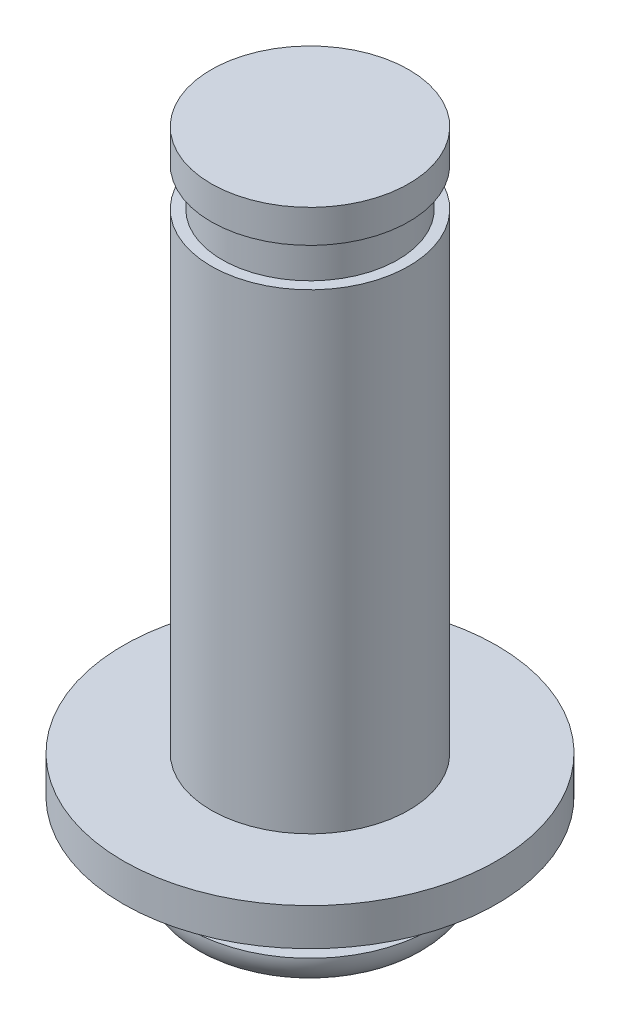
ISO-10303-21;
HEADER;
FILE_DESCRIPTION(('STEP AP214'),'2;1');
FILE_NAME('part.step','',(''),(''),'','','');
FILE_SCHEMA(('AUTOMOTIVE_DESIGN { 1 0 10303 214 1 1 1 1 }'));
ENDSEC;
DATA;
#1=APPLICATION_CONTEXT('core data for automotive mechanical design processes');
#2=APPLICATION_PROTOCOL_DEFINITION('international standard','automotive_design',2000,#1);
#3=PRODUCT_CONTEXT('',#1,'mechanical');
#4=PRODUCT('Part','Part','',(#3));
#5=PRODUCT_RELATED_PRODUCT_CATEGORY('part','',(#4));
#6=PRODUCT_DEFINITION_FORMATION('','',#4);
#7=PRODUCT_DEFINITION_CONTEXT('part definition',#1,'design');
#8=PRODUCT_DEFINITION('design','',#6,#7);
#9=PRODUCT_DEFINITION_SHAPE('','',#8);
#10=(LENGTH_UNIT() NAMED_UNIT(*) SI_UNIT(.MILLI.,.METRE.));
#11=(NAMED_UNIT(*) PLANE_ANGLE_UNIT() SI_UNIT($,.RADIAN.));
#12=(NAMED_UNIT(*) SI_UNIT($,.STERADIAN.) SOLID_ANGLE_UNIT());
#13=UNCERTAINTY_MEASURE_WITH_UNIT(LENGTH_MEASURE(1.E-05),#10,'distance_accuracy_value','');
#14=(GEOMETRIC_REPRESENTATION_CONTEXT(3) GLOBAL_UNCERTAINTY_ASSIGNED_CONTEXT((#13)) GLOBAL_UNIT_ASSIGNED_CONTEXT((#10,
#11,#12)) REPRESENTATION_CONTEXT('',''));
#15=CARTESIAN_POINT('',(0.,0.,0.));
#16=DIRECTION('',(0.,0.,1.));
#17=DIRECTION('',(1.,0.,0.));
#18=AXIS2_PLACEMENT_3D('',#15,#16,#17);
#19=CARTESIAN_POINT('',(0.,30.4,4.5));
#20=DIRECTION('',(0.,-1.,0.));
#21=DIRECTION('',(0.,0.,-1.));
#22=AXIS2_PLACEMENT_3D('',#19,#20,#21);
#23=PLANE('',#22);
#24=CARTESIAN_POINT('',(0.,30.4,0.));
#25=DIRECTION('',(0.,-1.,0.));
#26=DIRECTION('',(0.,0.,-1.));
#27=AXIS2_PLACEMENT_3D('',#24,#25,#26);
#28=CIRCLE('',#27,4.5);
#29=CARTESIAN_POINT('',(0.,30.4,-4.5));
#30=VERTEX_POINT('',#29);
#31=EDGE_CURVE('E77',#30,#30,#28,.T.);
#32=ORIENTED_EDGE('',*,*,#31,.F.);
#33=EDGE_LOOP('',(#32));
#34=FACE_BOUND('',#33,.T.);
#35=ADVANCED_FACE('F37',(#34),#23,.F.);
#36=CARTESIAN_POINT('',(0.,0.,0.));
#37=DIRECTION('',(0.,1.,0.));
#38=DIRECTION('',(0.,0.,1.));
#39=AXIS2_PLACEMENT_3D('',#36,#37,#38);
#40=PLANE('',#39);
#41=CARTESIAN_POINT('',(0.,0.,0.));
#42=DIRECTION('',(0.,-1.,0.));
#43=DIRECTION('',(0.,0.,-1.));
#44=AXIS2_PLACEMENT_3D('',#41,#42,#43);
#45=CIRCLE('',#44,4.);
#46=CARTESIAN_POINT('',(0.,0.,-4.));
#47=VERTEX_POINT('',#46);
#48=EDGE_CURVE('E10',#47,#47,#45,.T.);
#49=ORIENTED_EDGE('',*,*,#48,.T.);
#50=EDGE_LOOP('',(#49));
#51=FACE_BOUND('',#50,.T.);
#52=ADVANCED_FACE('F84',(#51),#40,.F.);
#53=CARTESIAN_POINT('',(0.,1.5,0.));
#54=DIRECTION('',(0.,-1.,0.));
#55=DIRECTION('',(0.,0.,-1.));
#56=AXIS2_PLACEMENT_3D('',#53,#54,#55);
#57=TOROIDAL_SURFACE('',#56,4.,1.5);
#58=ORIENTED_EDGE('',*,*,#48,.F.);
#59=EDGE_LOOP('',(#58));
#60=FACE_BOUND('',#59,.T.);
#61=CARTESIAN_POINT('',(0.,1.5,0.));
#62=DIRECTION('',(0.,-1.,0.));
#63=DIRECTION('',(0.,0.,-1.));
#64=AXIS2_PLACEMENT_3D('',#61,#62,#63);
#65=CIRCLE('',#64,5.5);
#66=CARTESIAN_POINT('',(0.,1.5,-5.5));
#67=VERTEX_POINT('',#66);
#68=EDGE_CURVE('E43',#67,#67,#65,.T.);
#69=ORIENTED_EDGE('',*,*,#68,.T.);
#70=EDGE_LOOP('',(#69));
#71=FACE_BOUND('',#70,.T.);
#72=ADVANCED_FACE('F88',(#60,#71),#57,.T.);
#73=CARTESIAN_POINT('',(0.,1.5,5.5));
#74=DIRECTION('',(0.,-1.,0.));
#75=DIRECTION('',(0.,0.,-1.));
#76=AXIS2_PLACEMENT_3D('',#73,#74,#75);
#77=PLANE('',#76);
#78=ORIENTED_EDGE('',*,*,#68,.F.);
#79=EDGE_LOOP('',(#78));
#80=FACE_BOUND('',#79,.T.);
#81=CARTESIAN_POINT('',(0.,1.5,0.));
#82=DIRECTION('',(0.,-1.,0.));
#83=DIRECTION('',(0.,0.,-1.));
#84=AXIS2_PLACEMENT_3D('',#81,#82,#83);
#85=CIRCLE('',#84,4.5);
#86=CARTESIAN_POINT('',(0.,1.5,-4.5));
#87=VERTEX_POINT('',#86);
#88=EDGE_CURVE('E47',#87,#87,#85,.T.);
#89=ORIENTED_EDGE('',*,*,#88,.T.);
#90=EDGE_LOOP('',(#89));
#91=FACE_BOUND('',#90,.T.);
#92=ADVANCED_FACE('F92',(#80,#91),#77,.F.);
#93=CARTESIAN_POINT('',(0.,0.,0.));
#94=DIRECTION('',(0.,-1.,0.));
#95=DIRECTION('',(0.,0.,-1.));
#96=AXIS2_PLACEMENT_3D('',#93,#94,#95);
#97=CYLINDRICAL_SURFACE('',#96,4.5);
#98=ORIENTED_EDGE('',*,*,#88,.F.);
#99=EDGE_LOOP('',(#98));
#100=FACE_BOUND('',#99,.T.);
#101=CARTESIAN_POINT('',(0.,4.,0.));
#102=DIRECTION('',(0.,-1.,0.));
#103=DIRECTION('',(0.,0.,-1.));
#104=AXIS2_PLACEMENT_3D('',#101,#102,#103);
#105=CIRCLE('',#104,4.5);
#106=CARTESIAN_POINT('',(0.,4.,-4.5));
#107=VERTEX_POINT('',#106);
#108=EDGE_CURVE('E51',#107,#107,#105,.T.);
#109=ORIENTED_EDGE('',*,*,#108,.T.);
#110=EDGE_LOOP('',(#109));
#111=FACE_BOUND('',#110,.T.);
#112=ADVANCED_FACE('F98',(#100,#111),#97,.T.);
#113=CARTESIAN_POINT('',(0.,4.,4.5));
#114=DIRECTION('',(0.,1.,0.));
#115=DIRECTION('',(0.,0.,1.));
#116=AXIS2_PLACEMENT_3D('',#113,#114,#115);
#117=PLANE('',#116);
#118=ORIENTED_EDGE('',*,*,#108,.F.);
#119=EDGE_LOOP('',(#118));
#120=FACE_BOUND('',#119,.T.);
#121=CARTESIAN_POINT('',(0.,4.,0.));
#122=DIRECTION('',(0.,-1.,0.));
#123=DIRECTION('',(0.,0.,-1.));
#124=AXIS2_PLACEMENT_3D('',#121,#122,#123);
#125=CIRCLE('',#124,8.5);
#126=CARTESIAN_POINT('',(0.,4.,-8.5));
#127=VERTEX_POINT('',#126);
#128=EDGE_CURVE('E56',#127,#127,#125,.T.);
#129=ORIENTED_EDGE('',*,*,#128,.T.);
#130=EDGE_LOOP('',(#129));
#131=FACE_BOUND('',#130,.T.);
#132=ADVANCED_FACE('F102',(#120,#131),#117,.F.);
#133=CARTESIAN_POINT('',(0.,0.,0.));
#134=DIRECTION('',(0.,-1.,0.));
#135=DIRECTION('',(0.,0.,-1.));
#136=AXIS2_PLACEMENT_3D('',#133,#134,#135);
#137=CYLINDRICAL_SURFACE('',#136,8.5);
#138=ORIENTED_EDGE('',*,*,#128,.F.);
#139=EDGE_LOOP('',(#138));
#140=FACE_BOUND('',#139,.T.);
#141=CARTESIAN_POINT('',(0.,5.7,0.));
#142=DIRECTION('',(0.,-1.,0.));
#143=DIRECTION('',(0.,0.,-1.));
#144=AXIS2_PLACEMENT_3D('',#141,#142,#143);
#145=CIRCLE('',#144,8.5);
#146=CARTESIAN_POINT('',(0.,5.7,-8.5));
#147=VERTEX_POINT('',#146);
#148=EDGE_CURVE('E59',#147,#147,#145,.T.);
#149=ORIENTED_EDGE('',*,*,#148,.T.);
#150=EDGE_LOOP('',(#149));
#151=FACE_BOUND('',#150,.T.);
#152=ADVANCED_FACE('F106',(#140,#151),#137,.T.);
#153=CARTESIAN_POINT('',(0.,5.7,8.5));
#154=DIRECTION('',(0.,-1.,0.));
#155=DIRECTION('',(0.,0.,-1.));
#156=AXIS2_PLACEMENT_3D('',#153,#154,#155);
#157=PLANE('',#156);
#158=ORIENTED_EDGE('',*,*,#148,.F.);
#159=EDGE_LOOP('',(#158));
#160=FACE_BOUND('',#159,.T.);
#161=CARTESIAN_POINT('',(0.,5.7,0.));
#162=DIRECTION('',(0.,-1.,0.));
#163=DIRECTION('',(0.,0.,-1.));
#164=AXIS2_PLACEMENT_3D('',#161,#162,#163);
#165=CIRCLE('',#164,4.5);
#166=CARTESIAN_POINT('',(0.,5.7,-4.5));
#167=VERTEX_POINT('',#166);
#168=EDGE_CURVE('E62',#167,#167,#165,.T.);
#169=ORIENTED_EDGE('',*,*,#168,.T.);
#170=EDGE_LOOP('',(#169));
#171=FACE_BOUND('',#170,.T.);
#172=ADVANCED_FACE('F110',(#160,#171),#157,.F.);
#173=CARTESIAN_POINT('',(0.,0.,0.));
#174=DIRECTION('',(0.,-1.,0.));
#175=DIRECTION('',(0.,0.,-1.));
#176=AXIS2_PLACEMENT_3D('',#173,#174,#175);
#177=CYLINDRICAL_SURFACE('',#176,4.5);
#178=ORIENTED_EDGE('',*,*,#168,.F.);
#179=EDGE_LOOP('',(#178));
#180=FACE_BOUND('',#179,.T.);
#181=CARTESIAN_POINT('',(0.,27.15,0.));
#182=DIRECTION('',(0.,-1.,0.));
#183=DIRECTION('',(0.,0.,-1.));
#184=AXIS2_PLACEMENT_3D('',#181,#182,#183);
#185=CIRCLE('',#184,4.5);
#186=CARTESIAN_POINT('',(0.,27.15,-4.5));
#187=VERTEX_POINT('',#186);
#188=EDGE_CURVE('E65',#187,#187,#185,.T.);
#189=ORIENTED_EDGE('',*,*,#188,.T.);
#190=EDGE_LOOP('',(#189));
#191=FACE_BOUND('',#190,.T.);
#192=ADVANCED_FACE('F114',(#180,#191),#177,.T.);
#193=CARTESIAN_POINT('',(0.,27.15,4.5));
#194=DIRECTION('',(0.,-1.,0.));
#195=DIRECTION('',(0.,0.,-1.));
#196=AXIS2_PLACEMENT_3D('',#193,#194,#195);
#197=PLANE('',#196);
#198=ORIENTED_EDGE('',*,*,#188,.F.);
#199=EDGE_LOOP('',(#198));
#200=FACE_BOUND('',#199,.T.);
#201=CARTESIAN_POINT('',(0.,27.15,0.));
#202=DIRECTION('',(0.,-1.,0.));
#203=DIRECTION('',(0.,0.,-1.));
#204=AXIS2_PLACEMENT_3D('',#201,#202,#203);
#205=CIRCLE('',#204,4.);
#206=CARTESIAN_POINT('',(0.,27.15,-4.));
#207=VERTEX_POINT('',#206);
#208=EDGE_CURVE('E68',#207,#207,#205,.T.);
#209=ORIENTED_EDGE('',*,*,#208,.T.);
#210=EDGE_LOOP('',(#209));
#211=FACE_BOUND('',#210,.T.);
#212=ADVANCED_FACE('F118',(#200,#211),#197,.F.);
#213=CARTESIAN_POINT('',(0.,0.,0.));
#214=DIRECTION('',(0.,-1.,0.));
#215=DIRECTION('',(0.,0.,-1.));
#216=AXIS2_PLACEMENT_3D('',#213,#214,#215);
#217=CYLINDRICAL_SURFACE('',#216,4.);
#218=ORIENTED_EDGE('',*,*,#208,.F.);
#219=EDGE_LOOP('',(#218));
#220=FACE_BOUND('',#219,.T.);
#221=CARTESIAN_POINT('',(0.,28.9,0.));
#222=DIRECTION('',(0.,-1.,0.));
#223=DIRECTION('',(0.,0.,-1.));
#224=AXIS2_PLACEMENT_3D('',#221,#222,#223);
#225=CIRCLE('',#224,4.);
#226=CARTESIAN_POINT('',(0.,28.9,-4.));
#227=VERTEX_POINT('',#226);
#228=EDGE_CURVE('E71',#227,#227,#225,.T.);
#229=ORIENTED_EDGE('',*,*,#228,.T.);
#230=EDGE_LOOP('',(#229));
#231=FACE_BOUND('',#230,.T.);
#232=ADVANCED_FACE('F122',(#220,#231),#217,.T.);
#233=CARTESIAN_POINT('',(0.,28.9,4.));
#234=DIRECTION('',(0.,1.,0.));
#235=DIRECTION('',(0.,0.,1.));
#236=AXIS2_PLACEMENT_3D('',#233,#234,#235);
#237=PLANE('',#236);
#238=ORIENTED_EDGE('',*,*,#228,.F.);
#239=EDGE_LOOP('',(#238));
#240=FACE_BOUND('',#239,.T.);
#241=CARTESIAN_POINT('',(0.,28.9,0.));
#242=DIRECTION('',(0.,-1.,0.));
#243=DIRECTION('',(0.,0.,-1.));
#244=AXIS2_PLACEMENT_3D('',#241,#242,#243);
#245=CIRCLE('',#244,4.5);
#246=CARTESIAN_POINT('',(0.,28.9,-4.5));
#247=VERTEX_POINT('',#246);
#248=EDGE_CURVE('E74',#247,#247,#245,.T.);
#249=ORIENTED_EDGE('',*,*,#248,.T.);
#250=EDGE_LOOP('',(#249));
#251=FACE_BOUND('',#250,.T.);
#252=ADVANCED_FACE('F126',(#240,#251),#237,.F.);
#253=CARTESIAN_POINT('',(0.,0.,0.));
#254=DIRECTION('',(0.,-1.,0.));
#255=DIRECTION('',(0.,0.,-1.));
#256=AXIS2_PLACEMENT_3D('',#253,#254,#255);
#257=CYLINDRICAL_SURFACE('',#256,4.5);
#258=ORIENTED_EDGE('',*,*,#248,.F.);
#259=EDGE_LOOP('',(#258));
#260=FACE_BOUND('',#259,.T.);
#261=ORIENTED_EDGE('',*,*,#31,.T.);
#262=EDGE_LOOP('',(#261));
#263=FACE_BOUND('',#262,.T.);
#264=ADVANCED_FACE('F81',(#260,#263),#257,.T.);
#265=CLOSED_SHELL('',(#35,#52,#72,#92,#112,#132,#152,#172,#192,#212,#232,#252,#264));
#266=MANIFOLD_SOLID_BREP('B2',#265);
#267=ADVANCED_BREP_SHAPE_REPRESENTATION('',(#18,#266),#14);
#268=SHAPE_DEFINITION_REPRESENTATION(#9,#267);
ENDSEC;
END-ISO-10303-21;
